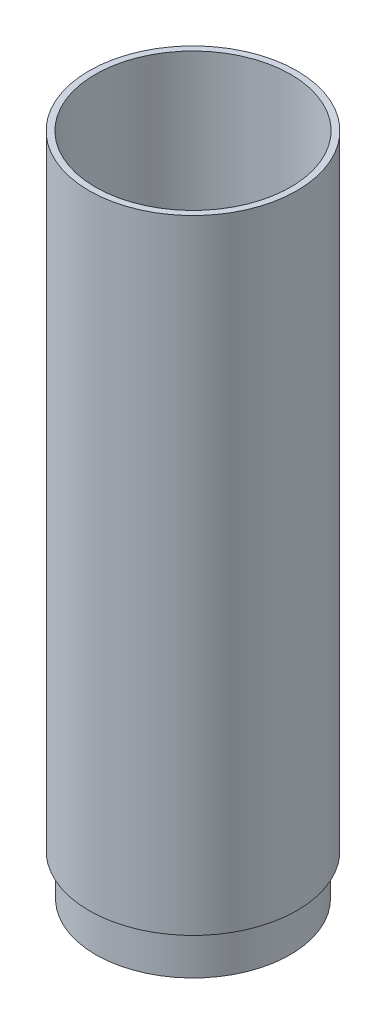
ISO-10303-21;
HEADER;
FILE_DESCRIPTION(('STEP AP214'),'2;1');
FILE_NAME('part.step','',(''),(''),'','','');
FILE_SCHEMA(('AUTOMOTIVE_DESIGN { 1 0 10303 214 1 1 1 1 }'));
ENDSEC;
DATA;
#1=APPLICATION_CONTEXT('core data for automotive mechanical design processes');
#2=APPLICATION_PROTOCOL_DEFINITION('international standard','automotive_design',2000,#1);
#3=PRODUCT_CONTEXT('',#1,'mechanical');
#4=PRODUCT('Part','Part','',(#3));
#5=PRODUCT_RELATED_PRODUCT_CATEGORY('part','',(#4));
#6=PRODUCT_DEFINITION_FORMATION('','',#4);
#7=PRODUCT_DEFINITION_CONTEXT('part definition',#1,'design');
#8=PRODUCT_DEFINITION('design','',#6,#7);
#9=PRODUCT_DEFINITION_SHAPE('','',#8);
#10=(LENGTH_UNIT() NAMED_UNIT(*) SI_UNIT(.MILLI.,.METRE.));
#11=(NAMED_UNIT(*) PLANE_ANGLE_UNIT() SI_UNIT($,.RADIAN.));
#12=(NAMED_UNIT(*) SI_UNIT($,.STERADIAN.) SOLID_ANGLE_UNIT());
#13=UNCERTAINTY_MEASURE_WITH_UNIT(LENGTH_MEASURE(1.E-05),#10,'distance_accuracy_value','');
#14=(GEOMETRIC_REPRESENTATION_CONTEXT(3) GLOBAL_UNCERTAINTY_ASSIGNED_CONTEXT((#13)) GLOBAL_UNIT_ASSIGNED_CONTEXT((#10,
#11,#12)) REPRESENTATION_CONTEXT('',''));
#15=CARTESIAN_POINT('',(0.,0.,0.));
#16=DIRECTION('',(0.,0.,1.));
#17=DIRECTION('',(1.,0.,0.));
#18=AXIS2_PLACEMENT_3D('',#15,#16,#17);
#19=CARTESIAN_POINT('',(0.,45.,0.));
#20=DIRECTION('',(0.,1.,0.));
#21=DIRECTION('',(0.,0.,1.));
#22=AXIS2_PLACEMENT_3D('',#19,#20,#21);
#23=PLANE('',#22);
#24=CARTESIAN_POINT('',(0.,45.,0.));
#25=DIRECTION('',(0.,1.,0.));
#26=DIRECTION('',(0.,0.,1.));
#27=AXIS2_PLACEMENT_3D('',#24,#25,#26);
#28=CIRCLE('',#27,20.);
#29=CARTESIAN_POINT('',(0.,45.,20.));
#30=VERTEX_POINT('',#29);
#31=EDGE_CURVE('E75',#30,#30,#28,.T.);
#32=ORIENTED_EDGE('',*,*,#31,.F.);
#33=EDGE_LOOP('',(#32));
#34=FACE_BOUND('',#33,.T.);
#35=CARTESIAN_POINT('',(0.,45.,0.));
#36=DIRECTION('',(0.,1.,0.));
#37=DIRECTION('',(0.,0.,1.));
#38=AXIS2_PLACEMENT_3D('',#35,#36,#37);
#39=CIRCLE('',#38,23.5);
#40=CARTESIAN_POINT('',(0.,45.,23.5));
#41=VERTEX_POINT('',#40);
#42=EDGE_CURVE('E65',#41,#41,#39,.T.);
#43=ORIENTED_EDGE('',*,*,#42,.T.);
#44=EDGE_LOOP('',(#43));
#45=FACE_BOUND('',#44,.T.);
#46=ADVANCED_FACE('F39',(#34,#45),#23,.T.);
#47=CARTESIAN_POINT('',(0.,42.,0.));
#48=DIRECTION('',(0.,-1.,0.));
#49=DIRECTION('',(0.,0.,-1.));
#50=AXIS2_PLACEMENT_3D('',#47,#48,#49);
#51=CYLINDRICAL_SURFACE('',#50,25.);
#52=CARTESIAN_POINT('',(0.,140.,0.));
#53=DIRECTION('',(0.,1.,0.));
#54=DIRECTION('',(0.,0.,1.));
#55=AXIS2_PLACEMENT_3D('',#52,#53,#54);
#56=CIRCLE('',#55,25.);
#57=CARTESIAN_POINT('',(0.,140.,-25.));
#58=VERTEX_POINT('',#57);
#59=EDGE_CURVE('E68',#58,#58,#56,.T.);
#60=CARTESIAN_POINT('',(0.,-10.,0.));
#61=DIRECTION('',(0.,-1.,0.));
#62=DIRECTION('',(0.,0.,-1.));
#63=AXIS2_PLACEMENT_3D('',#60,#61,#62);
#64=CIRCLE('',#63,25.);
#65=CARTESIAN_POINT('',(0.,-9.99999999999999,-25.));
#66=VERTEX_POINT('',#65);
#67=EDGE_CURVE('E56',#66,#66,#64,.T.);
#68=CARTESIAN_POINT('',(0.,140.,-25.));
#69=CARTESIAN_POINT('',(0.,138.4375,-25.));
#70=CARTESIAN_POINT('',(0.,136.875,-25.));
#71=CARTESIAN_POINT('',(0.,133.75,-25.));
#72=CARTESIAN_POINT('',(0.,132.1875,-25.));
#73=CARTESIAN_POINT('',(0.,129.0625,-25.));
#74=CARTESIAN_POINT('',(0.,127.5,-25.));
#75=CARTESIAN_POINT('',(0.,124.375,-25.));
#76=CARTESIAN_POINT('',(0.,122.8125,-25.));
#77=CARTESIAN_POINT('',(0.,119.6875,-25.));
#78=CARTESIAN_POINT('',(0.,118.125,-25.));
#79=CARTESIAN_POINT('',(0.,115.,-25.));
#80=CARTESIAN_POINT('',(0.,113.4375,-25.));
#81=CARTESIAN_POINT('',(0.,110.3125,-25.));
#82=CARTESIAN_POINT('',(0.,108.75,-25.));
#83=CARTESIAN_POINT('',(0.,105.625,-25.));
#84=CARTESIAN_POINT('',(0.,104.0625,-25.));
#85=CARTESIAN_POINT('',(0.,100.9375,-25.));
#86=CARTESIAN_POINT('',(0.,99.375,-25.));
#87=CARTESIAN_POINT('',(0.,96.25,-25.));
#88=CARTESIAN_POINT('',(0.,94.6875,-25.));
#89=CARTESIAN_POINT('',(0.,91.5625,-25.));
#90=CARTESIAN_POINT('',(0.,90.,-25.));
#91=CARTESIAN_POINT('',(0.,86.875,-25.));
#92=CARTESIAN_POINT('',(0.,85.3125,-25.));
#93=CARTESIAN_POINT('',(0.,82.1875,-25.));
#94=CARTESIAN_POINT('',(0.,80.625,-25.));
#95=CARTESIAN_POINT('',(0.,77.5,-25.));
#96=CARTESIAN_POINT('',(0.,75.9375,-25.));
#97=CARTESIAN_POINT('',(0.,72.8125,-25.));
#98=CARTESIAN_POINT('',(0.,71.25,-25.));
#99=CARTESIAN_POINT('',(0.,68.125,-25.));
#100=CARTESIAN_POINT('',(0.,66.5625,-25.));
#101=CARTESIAN_POINT('',(0.,63.4375,-25.));
#102=CARTESIAN_POINT('',(0.,61.875,-25.));
#103=CARTESIAN_POINT('',(0.,58.75,-25.));
#104=CARTESIAN_POINT('',(0.,57.1875,-25.));
#105=CARTESIAN_POINT('',(0.,54.0625,-25.));
#106=CARTESIAN_POINT('',(0.,52.5,-25.));
#107=CARTESIAN_POINT('',(0.,49.375,-25.));
#108=CARTESIAN_POINT('',(0.,47.8125,-25.));
#109=CARTESIAN_POINT('',(0.,44.6875,-25.));
#110=CARTESIAN_POINT('',(0.,43.125,-25.));
#111=CARTESIAN_POINT('',(0.,40.,-25.));
#112=CARTESIAN_POINT('',(0.,38.4375,-25.));
#113=CARTESIAN_POINT('',(0.,35.3125,-25.));
#114=CARTESIAN_POINT('',(0.,33.75,-25.));
#115=CARTESIAN_POINT('',(0.,30.625,-25.));
#116=CARTESIAN_POINT('',(0.,29.0625,-25.));
#117=CARTESIAN_POINT('',(0.,25.9375,-25.));
#118=CARTESIAN_POINT('',(0.,24.375,-25.));
#119=CARTESIAN_POINT('',(0.,21.25,-25.));
#120=CARTESIAN_POINT('',(0.,19.6875,-25.));
#121=CARTESIAN_POINT('',(0.,16.5625,-25.));
#122=CARTESIAN_POINT('',(0.,15.,-25.));
#123=CARTESIAN_POINT('',(0.,11.875,-25.));
#124=CARTESIAN_POINT('',(0.,10.3125,-25.));
#125=CARTESIAN_POINT('',(0.,7.18749999999999,-25.));
#126=CARTESIAN_POINT('',(0.,5.62499999999999,-25.));
#127=CARTESIAN_POINT('',(0.,2.49999999999999,-25.));
#128=CARTESIAN_POINT('',(0.,0.937499999999989,-25.));
#129=CARTESIAN_POINT('',(0.,-2.18750000000001,-25.));
#130=CARTESIAN_POINT('',(0.,-3.75,-25.));
#131=CARTESIAN_POINT('',(0.,-6.875,-25.));
#132=CARTESIAN_POINT('',(0.,-8.43750000000001,-25.));
#133=CARTESIAN_POINT('',(0.,-10.,-25.));
#134=B_SPLINE_CURVE_WITH_KNOTS('',3,(#68,#69,#70,#71,#72,#73,#74,#75,#76,#77,#78,#79,#80,#81,
#82,#83,#84,#85,#86,#87,#88,#89,#90,#91,#92,#93,#94,#95,#96,#97,#98,#99,#100,#101,#102,#103,
#104,#105,#106,#107,#108,#109,#110,#111,#112,#113,#114,#115,#116,#117,#118,#119,#120,#121,#122,
#123,#124,#125,#126,#127,#128,#129,#130,#131,#132,#133),.UNSPECIFIED.,.F.,.F.,(4,2,2,2,2,2,2,2,
2,2,2,2,2,2,2,2,2,2,2,2,2,2,2,2,2,2,2,2,2,2,2,2,4),(0.,4.68749999999998,9.37499999999999,
14.0625,18.75,23.4375,28.125,32.8125,37.5,42.1875,46.875,51.5625,56.25,60.9375,65.625,70.3125,
75.,79.6875,84.375,89.0625,93.75,98.4375,103.125,107.8125,112.5,117.1875,121.875,126.5625,
131.25,135.9375,140.625,145.3125,150.),.UNSPECIFIED.);
#135=EDGE_CURVE('BSEAM41',#58,#66,#134,.T.);
#136=ORIENTED_EDGE('',*,*,#59,.F.);
#137=ORIENTED_EDGE('',*,*,#67,.F.);
#138=ORIENTED_EDGE('',*,*,#135,.T.);
#139=ORIENTED_EDGE('',*,*,#135,.F.);
#140=EDGE_LOOP('',(#136,#138,#137,#139));
#141=FACE_BOUND('',#140,.T.);
#142=ADVANCED_FACE('F41',(#141),#51,.T.);
#143=CARTESIAN_POINT('',(0.,42.,0.));
#144=DIRECTION('',(0.,-1.,0.));
#145=DIRECTION('',(0.,0.,-1.));
#146=AXIS2_PLACEMENT_3D('',#143,#144,#145);
#147=CYLINDRICAL_SURFACE('',#146,23.5);
#148=CARTESIAN_POINT('',(0.,42.,0.));
#149=DIRECTION('',(0.,1.,0.));
#150=DIRECTION('',(0.,0.,1.));
#151=AXIS2_PLACEMENT_3D('',#148,#149,#150);
#152=CIRCLE('',#151,23.5);
#153=CARTESIAN_POINT('',(0.,42.,-23.5));
#154=VERTEX_POINT('',#153);
#155=EDGE_CURVE('E51',#154,#154,#152,.T.);
#156=CARTESIAN_POINT('',(0.,0.,0.));
#157=DIRECTION('',(0.,1.,0.));
#158=DIRECTION('',(0.,0.,1.));
#159=AXIS2_PLACEMENT_3D('',#156,#157,#158);
#160=CIRCLE('',#159,23.5);
#161=CARTESIAN_POINT('',(0.,0.,-23.5));
#162=VERTEX_POINT('',#161);
#163=EDGE_CURVE('E43',#162,#162,#160,.T.);
#164=CARTESIAN_POINT('',(0.,42.,-23.5));
#165=CARTESIAN_POINT('',(0.,41.5625,-23.5));
#166=CARTESIAN_POINT('',(0.,41.125,-23.5));
#167=CARTESIAN_POINT('',(0.,40.25,-23.5));
#168=CARTESIAN_POINT('',(0.,39.8125,-23.5));
#169=CARTESIAN_POINT('',(0.,38.9375,-23.5));
#170=CARTESIAN_POINT('',(0.,38.5,-23.5));
#171=CARTESIAN_POINT('',(0.,37.625,-23.5));
#172=CARTESIAN_POINT('',(0.,37.1875,-23.5));
#173=CARTESIAN_POINT('',(0.,36.3125,-23.5));
#174=CARTESIAN_POINT('',(0.,35.875,-23.5));
#175=CARTESIAN_POINT('',(0.,35.,-23.5));
#176=CARTESIAN_POINT('',(0.,34.5625,-23.5));
#177=CARTESIAN_POINT('',(0.,33.6875,-23.5));
#178=CARTESIAN_POINT('',(0.,33.25,-23.5));
#179=CARTESIAN_POINT('',(0.,32.375,-23.5));
#180=CARTESIAN_POINT('',(0.,31.9375,-23.5));
#181=CARTESIAN_POINT('',(0.,31.0625,-23.5));
#182=CARTESIAN_POINT('',(0.,30.625,-23.5));
#183=CARTESIAN_POINT('',(0.,29.75,-23.5));
#184=CARTESIAN_POINT('',(0.,29.3125,-23.5));
#185=CARTESIAN_POINT('',(0.,28.4375,-23.5));
#186=CARTESIAN_POINT('',(0.,28.,-23.5));
#187=CARTESIAN_POINT('',(0.,27.125,-23.5));
#188=CARTESIAN_POINT('',(0.,26.6875,-23.5));
#189=CARTESIAN_POINT('',(0.,25.8125,-23.5));
#190=CARTESIAN_POINT('',(0.,25.375,-23.5));
#191=CARTESIAN_POINT('',(0.,24.5,-23.5));
#192=CARTESIAN_POINT('',(0.,24.0625,-23.5));
#193=CARTESIAN_POINT('',(0.,23.1875,-23.5));
#194=CARTESIAN_POINT('',(0.,22.75,-23.5));
#195=CARTESIAN_POINT('',(0.,21.875,-23.5));
#196=CARTESIAN_POINT('',(0.,21.4375,-23.5));
#197=CARTESIAN_POINT('',(0.,20.5625,-23.5));
#198=CARTESIAN_POINT('',(0.,20.125,-23.5));
#199=CARTESIAN_POINT('',(0.,19.25,-23.5));
#200=CARTESIAN_POINT('',(0.,18.8125,-23.5));
#201=CARTESIAN_POINT('',(0.,17.9375,-23.5));
#202=CARTESIAN_POINT('',(0.,17.5,-23.5));
#203=CARTESIAN_POINT('',(0.,16.625,-23.5));
#204=CARTESIAN_POINT('',(0.,16.1875,-23.5));
#205=CARTESIAN_POINT('',(0.,15.3125,-23.5));
#206=CARTESIAN_POINT('',(0.,14.875,-23.5));
#207=CARTESIAN_POINT('',(0.,14.,-23.5));
#208=CARTESIAN_POINT('',(0.,13.5625,-23.5));
#209=CARTESIAN_POINT('',(0.,12.6875,-23.5));
#210=CARTESIAN_POINT('',(0.,12.25,-23.5));
#211=CARTESIAN_POINT('',(0.,11.375,-23.5));
#212=CARTESIAN_POINT('',(0.,10.9375,-23.5));
#213=CARTESIAN_POINT('',(0.,10.0625,-23.5));
#214=CARTESIAN_POINT('',(0.,9.625,-23.5));
#215=CARTESIAN_POINT('',(0.,8.75,-23.5));
#216=CARTESIAN_POINT('',(0.,8.3125,-23.5));
#217=CARTESIAN_POINT('',(0.,7.4375,-23.5));
#218=CARTESIAN_POINT('',(0.,7.,-23.5));
#219=CARTESIAN_POINT('',(0.,6.125,-23.5));
#220=CARTESIAN_POINT('',(0.,5.6875,-23.5));
#221=CARTESIAN_POINT('',(0.,4.8125,-23.5));
#222=CARTESIAN_POINT('',(0.,4.375,-23.5));
#223=CARTESIAN_POINT('',(0.,3.5,-23.5));
#224=CARTESIAN_POINT('',(0.,3.0625,-23.5));
#225=CARTESIAN_POINT('',(0.,2.1875,-23.5));
#226=CARTESIAN_POINT('',(0.,1.75,-23.5));
#227=CARTESIAN_POINT('',(0.,0.875000000000001,-23.5));
#228=CARTESIAN_POINT('',(0.,0.4375,-23.5));
#229=CARTESIAN_POINT('',(0.,0.,-23.5));
#230=B_SPLINE_CURVE_WITH_KNOTS('',3,(#164,#165,#166,#167,#168,#169,#170,#171,#172,#173,#174,
#175,#176,#177,#178,#179,#180,#181,#182,#183,#184,#185,#186,#187,#188,#189,#190,#191,#192,#193,
#194,#195,#196,#197,#198,#199,#200,#201,#202,#203,#204,#205,#206,#207,#208,#209,#210,#211,#212,
#213,#214,#215,#216,#217,#218,#219,#220,#221,#222,#223,#224,#225,#226,#227,#228,#229),
.UNSPECIFIED.,.F.,.F.,(4,2,2,2,2,2,2,2,2,2,2,2,2,2,2,2,2,2,2,2,2,2,2,2,2,2,2,2,2,2,2,2,4),(0.,
1.31249999999999,2.625,3.9375,5.25,6.5625,7.87499999999999,9.18749999999999,10.5,11.8125,13.125,
14.4375,15.75,17.0625,18.375,19.6875,21.,22.3125,23.625,24.9375,26.25,27.5625,28.875,30.1875,
31.5,32.8125,34.125,35.4375,36.75,38.0625,39.375,40.6875,42.),.UNSPECIFIED.);
#231=EDGE_CURVE('BSEAM77',#154,#162,#230,.T.);
#232=ORIENTED_EDGE('',*,*,#155,.T.);
#233=ORIENTED_EDGE('',*,*,#163,.F.);
#234=ORIENTED_EDGE('',*,*,#231,.T.);
#235=ORIENTED_EDGE('',*,*,#231,.F.);
#236=EDGE_LOOP('',(#232,#234,#233,#235));
#237=FACE_BOUND('',#236,.T.);
#238=ADVANCED_FACE('F77',(#237),#147,.F.);
#239=CARTESIAN_POINT('',(0.,42.,0.));
#240=DIRECTION('',(0.,1.,0.));
#241=DIRECTION('',(0.,0.,1.));
#242=AXIS2_PLACEMENT_3D('',#239,#240,#241);
#243=PLANE('',#242);
#244=CARTESIAN_POINT('',(0.,42.,0.));
#245=DIRECTION('',(0.,1.,0.));
#246=DIRECTION('',(0.,0.,1.));
#247=AXIS2_PLACEMENT_3D('',#244,#245,#246);
#248=CIRCLE('',#247,20.);
#249=CARTESIAN_POINT('',(0.,42.,20.));
#250=VERTEX_POINT('',#249);
#251=EDGE_CURVE('E70',#250,#250,#248,.T.);
#252=ORIENTED_EDGE('',*,*,#251,.T.);
#253=EDGE_LOOP('',(#252));
#254=FACE_BOUND('',#253,.T.);
#255=ORIENTED_EDGE('',*,*,#155,.F.);
#256=EDGE_LOOP('',(#255));
#257=FACE_BOUND('',#256,.T.);
#258=ADVANCED_FACE('F84',(#254,#257),#243,.F.);
#259=CARTESIAN_POINT('',(0.,45.,0.));
#260=DIRECTION('',(0.,-1.,0.));
#261=DIRECTION('',(0.,0.,-1.));
#262=AXIS2_PLACEMENT_3D('',#259,#260,#261);
#263=CYLINDRICAL_SURFACE('',#262,20.);
#264=ORIENTED_EDGE('',*,*,#31,.T.);
#265=EDGE_LOOP('',(#264));
#266=FACE_BOUND('',#265,.T.);
#267=ORIENTED_EDGE('',*,*,#251,.F.);
#268=EDGE_LOOP('',(#267));
#269=FACE_BOUND('',#268,.T.);
#270=ADVANCED_FACE('F85',(#266,#269),#263,.F.);
#271=CARTESIAN_POINT('',(0.,140.,0.));
#272=DIRECTION('',(0.,-1.,0.));
#273=DIRECTION('',(0.,0.,-1.));
#274=AXIS2_PLACEMENT_3D('',#271,#272,#273);
#275=CYLINDRICAL_SURFACE('',#274,23.5);
#276=CARTESIAN_POINT('',(0.,140.,0.));
#277=DIRECTION('',(0.,1.,0.));
#278=DIRECTION('',(0.,0.,1.));
#279=AXIS2_PLACEMENT_3D('',#276,#277,#278);
#280=CIRCLE('',#279,23.5);
#281=CARTESIAN_POINT('',(0.,140.,23.5));
#282=VERTEX_POINT('',#281);
#283=EDGE_CURVE('E61',#282,#282,#280,.T.);
#284=ORIENTED_EDGE('',*,*,#283,.T.);
#285=EDGE_LOOP('',(#284));
#286=FACE_BOUND('',#285,.T.);
#287=ORIENTED_EDGE('',*,*,#42,.F.);
#288=EDGE_LOOP('',(#287));
#289=FACE_BOUND('',#288,.T.);
#290=ADVANCED_FACE('F93',(#286,#289),#275,.F.);
#291=CARTESIAN_POINT('',(0.,140.,0.));
#292=DIRECTION('',(0.,1.,0.));
#293=DIRECTION('',(0.,0.,1.));
#294=AXIS2_PLACEMENT_3D('',#291,#292,#293);
#295=PLANE('',#294);
#296=ORIENTED_EDGE('',*,*,#283,.F.);
#297=EDGE_LOOP('',(#296));
#298=FACE_BOUND('',#297,.T.);
#299=ORIENTED_EDGE('',*,*,#59,.T.);
#300=EDGE_LOOP('',(#299));
#301=FACE_BOUND('',#300,.T.);
#302=ADVANCED_FACE('F106',(#298,#301),#295,.T.);
#303=CARTESIAN_POINT('',(0.,0.,0.));
#304=DIRECTION('',(0.,-1.,0.));
#305=DIRECTION('',(0.,0.,-1.));
#306=AXIS2_PLACEMENT_3D('',#303,#304,#305);
#307=PLANE('',#306);
#308=CARTESIAN_POINT('',(0.,0.,0.));
#309=DIRECTION('',(0.,-1.,0.));
#310=DIRECTION('',(0.,0.,-1.));
#311=AXIS2_PLACEMENT_3D('',#308,#309,#310);
#312=CIRCLE('',#311,21.5);
#313=CARTESIAN_POINT('',(0.,0.,-21.5));
#314=VERTEX_POINT('',#313);
#315=EDGE_CURVE('E57',#314,#314,#312,.T.);
#316=ORIENTED_EDGE('',*,*,#315,.T.);
#317=EDGE_LOOP('',(#316));
#318=FACE_BOUND('',#317,.T.);
#319=ORIENTED_EDGE('',*,*,#163,.T.);
#320=EDGE_LOOP('',(#319));
#321=FACE_BOUND('',#320,.T.);
#322=ADVANCED_FACE('F109',(#318,#321),#307,.F.);
#323=CARTESIAN_POINT('',(0.,-10.,0.));
#324=DIRECTION('',(0.,-1.,0.));
#325=DIRECTION('',(0.,0.,-1.));
#326=AXIS2_PLACEMENT_3D('',#323,#324,#325);
#327=PLANE('',#326);
#328=CARTESIAN_POINT('',(0.,-10.,0.));
#329=DIRECTION('',(0.,-1.,0.));
#330=DIRECTION('',(0.,0.,-1.));
#331=AXIS2_PLACEMENT_3D('',#328,#329,#330);
#332=CIRCLE('',#331,23.4);
#333=CARTESIAN_POINT('',(0.,-10.,-23.4));
#334=VERTEX_POINT('',#333);
#335=EDGE_CURVE('E10',#334,#334,#332,.T.);
#336=ORIENTED_EDGE('',*,*,#335,.F.);
#337=EDGE_LOOP('',(#336));
#338=FACE_BOUND('',#337,.T.);
#339=ORIENTED_EDGE('',*,*,#67,.T.);
#340=EDGE_LOOP('',(#339));
#341=FACE_BOUND('',#340,.T.);
#342=ADVANCED_FACE('F111',(#338,#341),#327,.T.);
#343=CARTESIAN_POINT('',(0.,-10.,0.));
#344=DIRECTION('',(0.,1.,0.));
#345=DIRECTION('',(0.,0.,1.));
#346=AXIS2_PLACEMENT_3D('',#343,#344,#345);
#347=CYLINDRICAL_SURFACE('',#346,21.5);
#348=ORIENTED_EDGE('',*,*,#315,.F.);
#349=EDGE_LOOP('',(#348));
#350=FACE_BOUND('',#349,.T.);
#351=CARTESIAN_POINT('',(0.,-20.,0.));
#352=DIRECTION('',(0.,-1.,0.));
#353=DIRECTION('',(0.,0.,-1.));
#354=AXIS2_PLACEMENT_3D('',#351,#352,#353);
#355=CIRCLE('',#354,21.5);
#356=CARTESIAN_POINT('',(0.,-20.,-21.5));
#357=VERTEX_POINT('',#356);
#358=EDGE_CURVE('E139',#357,#357,#355,.T.);
#359=ORIENTED_EDGE('',*,*,#358,.T.);
#360=EDGE_LOOP('',(#359));
#361=FACE_BOUND('',#360,.T.);
#362=ADVANCED_FACE('F116',(#350,#361),#347,.F.);
#363=CARTESIAN_POINT('',(0.,-20.,0.));
#364=DIRECTION('',(0.,-1.,0.));
#365=DIRECTION('',(0.,0.,-1.));
#366=AXIS2_PLACEMENT_3D('',#363,#364,#365);
#367=PLANE('',#366);
#368=CARTESIAN_POINT('',(0.,-20.,0.));
#369=DIRECTION('',(0.,-1.,0.));
#370=DIRECTION('',(0.,0.,-1.));
#371=AXIS2_PLACEMENT_3D('',#368,#369,#370);
#372=CIRCLE('',#371,23.4);
#373=CARTESIAN_POINT('',(0.,-20.,-23.4));
#374=VERTEX_POINT('',#373);
#375=EDGE_CURVE('E53',#374,#374,#372,.T.);
#376=ORIENTED_EDGE('',*,*,#375,.T.);
#377=EDGE_LOOP('',(#376));
#378=FACE_BOUND('',#377,.T.);
#379=ORIENTED_EDGE('',*,*,#358,.F.);
#380=EDGE_LOOP('',(#379));
#381=FACE_BOUND('',#380,.T.);
#382=ADVANCED_FACE('F124',(#378,#381),#367,.T.);
#383=CARTESIAN_POINT('',(0.,-20.,0.));
#384=DIRECTION('',(0.,1.,0.));
#385=DIRECTION('',(0.,0.,1.));
#386=AXIS2_PLACEMENT_3D('',#383,#384,#385);
#387=CYLINDRICAL_SURFACE('',#386,23.4);
#388=ORIENTED_EDGE('',*,*,#375,.F.);
#389=EDGE_LOOP('',(#388));
#390=FACE_BOUND('',#389,.T.);
#391=ORIENTED_EDGE('',*,*,#335,.T.);
#392=EDGE_LOOP('',(#391));
#393=FACE_BOUND('',#392,.T.);
#394=ADVANCED_FACE('F125',(#390,#393),#387,.T.);
#395=CLOSED_SHELL('',(#46,#142,#238,#258,#270,#290,#302,#322,#342,#362,#382,#394));
#396=MANIFOLD_SOLID_BREP('B2',#395);
#397=ADVANCED_BREP_SHAPE_REPRESENTATION('',(#18,#396),#14);
#398=SHAPE_DEFINITION_REPRESENTATION(#9,#397);
ENDSEC;
END-ISO-10303-21;
